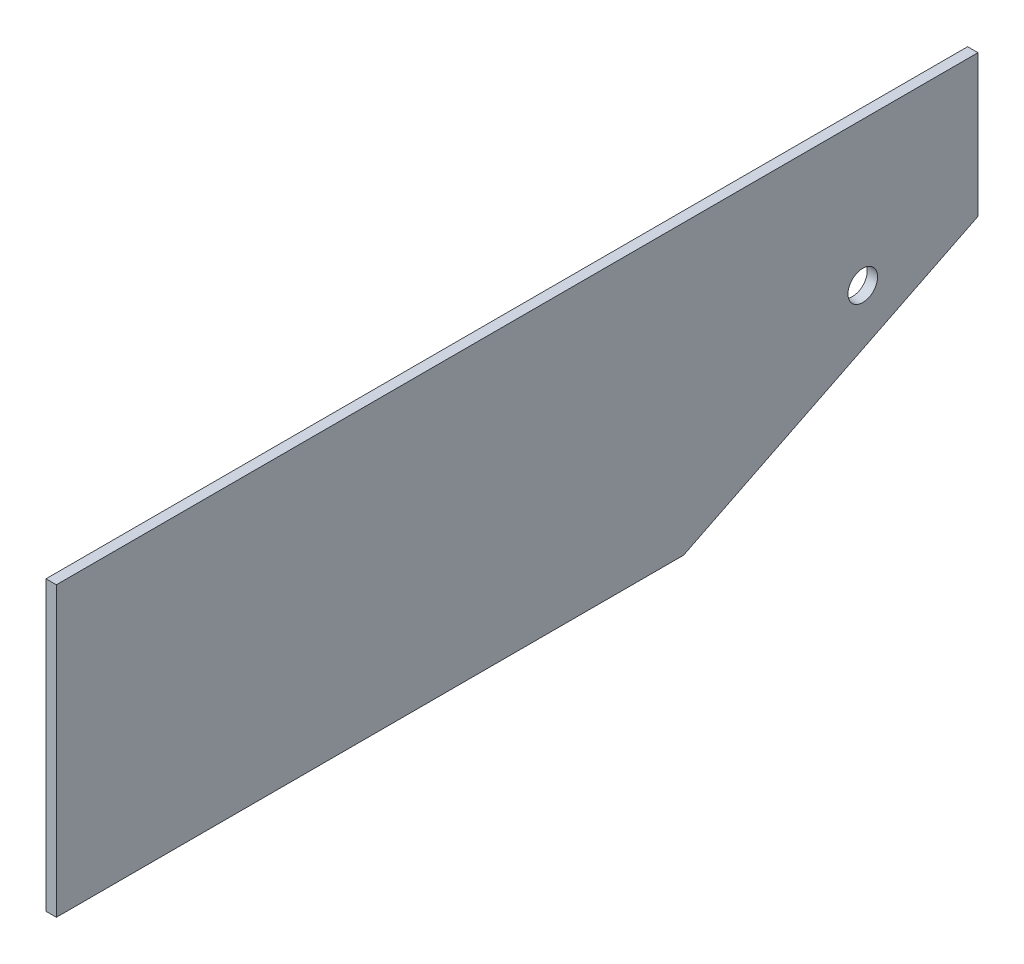
ISO-10303-21;
HEADER;
FILE_DESCRIPTION(('STEP AP214'),'2;1');
FILE_NAME('part.step','',(''),(''),'','','');
FILE_SCHEMA(('AUTOMOTIVE_DESIGN { 1 0 10303 214 1 1 1 1 }'));
ENDSEC;
DATA;
#1=APPLICATION_CONTEXT('core data for automotive mechanical design processes');
#2=APPLICATION_PROTOCOL_DEFINITION('international standard','automotive_design',2000,#1);
#3=PRODUCT_CONTEXT('',#1,'mechanical');
#4=PRODUCT('Part','Part','',(#3));
#5=PRODUCT_RELATED_PRODUCT_CATEGORY('part','',(#4));
#6=PRODUCT_DEFINITION_FORMATION('','',#4);
#7=PRODUCT_DEFINITION_CONTEXT('part definition',#1,'design');
#8=PRODUCT_DEFINITION('design','',#6,#7);
#9=PRODUCT_DEFINITION_SHAPE('','',#8);
#10=(LENGTH_UNIT() NAMED_UNIT(*) SI_UNIT(.MILLI.,.METRE.));
#11=(NAMED_UNIT(*) PLANE_ANGLE_UNIT() SI_UNIT($,.RADIAN.));
#12=(NAMED_UNIT(*) SI_UNIT($,.STERADIAN.) SOLID_ANGLE_UNIT());
#13=UNCERTAINTY_MEASURE_WITH_UNIT(LENGTH_MEASURE(1.E-05),#10,'distance_accuracy_value','');
#14=(GEOMETRIC_REPRESENTATION_CONTEXT(3) GLOBAL_UNCERTAINTY_ASSIGNED_CONTEXT((#13)) GLOBAL_UNIT_ASSIGNED_CONTEXT((#10,
#11,#12)) REPRESENTATION_CONTEXT('',''));
#15=CARTESIAN_POINT('',(0.,0.,0.));
#16=DIRECTION('',(0.,0.,1.));
#17=DIRECTION('',(1.,0.,0.));
#18=AXIS2_PLACEMENT_3D('',#15,#16,#17);
#19=CARTESIAN_POINT('',(1.143,0.,0.));
#20=DIRECTION('',(1.,0.,0.));
#21=DIRECTION('',(0.,0.,-1.));
#22=AXIS2_PLACEMENT_3D('',#19,#20,#21);
#23=PLANE('',#22);
#24=CARTESIAN_POINT('',(1.143,0.,-76.2));
#25=DIRECTION('',(1.,0.,0.));
#26=DIRECTION('',(0.,0.,-1.));
#27=AXIS2_PLACEMENT_3D('',#24,#25,#26);
#28=CIRCLE('',#27,3.2639);
#29=CARTESIAN_POINT('',(1.143,0.,-79.4639));
#30=VERTEX_POINT('',#29);
#31=EDGE_CURVE('E19',#30,#30,#28,.F.);
#32=ORIENTED_EDGE('',*,*,#31,.T.);
#33=EDGE_LOOP('',(#32));
#34=FACE_BOUND('',#33,.T.);
#35=DIRECTION('',(0.,0.,-1.));
#36=VECTOR('',#35,1.);
#37=CARTESIAN_POINT('',(1.143,-31.75,101.6));
#38=LINE('',#37,#36);
#39=CARTESIAN_POINT('',(1.143,-31.7500000000009,-36.692038667694));
#40=VERTEX_POINT('',#39);
#41=CARTESIAN_POINT('',(1.143,-31.75,101.6));
#42=VERTEX_POINT('',#41);
#43=EDGE_CURVE('E77',#40,#42,#38,.F.);
#44=ORIENTED_EDGE('',*,*,#43,.F.);
#45=DIRECTION('',(0.,-0.444883376374209,0.895588511218118));
#46=VECTOR('',#45,1.);
#47=CARTESIAN_POINT('',(1.143,0.493014095617792,-101.6));
#48=LINE('',#47,#46);
#49=CARTESIAN_POINT('',(1.143,0.493014095617792,-101.6));
#50=VERTEX_POINT('',#49);
#51=EDGE_CURVE('E73',#40,#50,#48,.F.);
#52=ORIENTED_EDGE('',*,*,#51,.T.);
#53=DIRECTION('',(0.,1.,0.));
#54=VECTOR('',#53,1.);
#55=CARTESIAN_POINT('',(1.143,-31.75,-101.6));
#56=LINE('',#55,#54);
#57=CARTESIAN_POINT('',(1.143,31.75,-101.6));
#58=VERTEX_POINT('',#57);
#59=EDGE_CURVE('E64',#58,#50,#56,.F.);
#60=ORIENTED_EDGE('',*,*,#59,.F.);
#61=DIRECTION('',(0.,0.,1.));
#62=VECTOR('',#61,1.);
#63=CARTESIAN_POINT('',(1.143,31.75,-101.6));
#64=LINE('',#63,#62);
#65=CARTESIAN_POINT('',(1.143,31.75,101.6));
#66=VERTEX_POINT('',#65);
#67=EDGE_CURVE('E59',#66,#58,#64,.F.);
#68=ORIENTED_EDGE('',*,*,#67,.F.);
#69=DIRECTION('',(0.,1.,0.));
#70=VECTOR('',#69,1.);
#71=CARTESIAN_POINT('',(1.143,31.75,101.6));
#72=LINE('',#71,#70);
#73=EDGE_CURVE('E89',#42,#66,#72,.T.);
#74=ORIENTED_EDGE('',*,*,#73,.F.);
#75=EDGE_LOOP('',(#44,#52,#60,#68,#74));
#76=FACE_BOUND('',#75,.T.);
#77=ADVANCED_FACE('F16',(#34,#76),#23,.T.);
#78=CARTESIAN_POINT('',(1.143,0.493014095617792,-101.6));
#79=DIRECTION('',(0.,0.895588511218118,0.444883376374209));
#80=DIRECTION('',(0.,-0.444883376374209,0.895588511218118));
#81=AXIS2_PLACEMENT_3D('',#78,#79,#80);
#82=PLANE('',#81);
#83=ORIENTED_EDGE('',*,*,#51,.F.);
#84=DIRECTION('',(1.,0.,0.));
#85=VECTOR('',#84,1.);
#86=CARTESIAN_POINT('',(-1.143,-31.75,-36.6920386676936));
#87=LINE('',#86,#85);
#88=CARTESIAN_POINT('',(-1.143,-31.7500000000018,-36.6920386676945));
#89=VERTEX_POINT('',#88);
#90=EDGE_CURVE('E95',#89,#40,#87,.T.);
#91=ORIENTED_EDGE('',*,*,#90,.F.);
#92=DIRECTION('',(0.,0.44488337637416,-0.895588511218142));
#93=VECTOR('',#92,1.);
#94=CARTESIAN_POINT('',(-1.143,-31.75,-36.6920386676936));
#95=LINE('',#94,#93);
#96=CARTESIAN_POINT('',(-1.143,0.493014095617792,-101.6));
#97=VERTEX_POINT('',#96);
#98=EDGE_CURVE('E84',#89,#97,#95,.T.);
#99=ORIENTED_EDGE('',*,*,#98,.T.);
#100=DIRECTION('',(-1.,0.,0.));
#101=VECTOR('',#100,1.);
#102=CARTESIAN_POINT('',(-1.143,0.493014095617791,-101.6));
#103=LINE('',#102,#101);
#104=EDGE_CURVE('E69',#50,#97,#103,.T.);
#105=ORIENTED_EDGE('',*,*,#104,.F.);
#106=EDGE_LOOP('',(#83,#91,#99,#105));
#107=FACE_BOUND('',#106,.T.);
#108=ADVANCED_FACE('F83',(#107),#82,.F.);
#109=CARTESIAN_POINT('',(-1.143,-31.75,-101.6));
#110=DIRECTION('',(0.,0.,-1.));
#111=DIRECTION('',(-1.,0.,0.));
#112=AXIS2_PLACEMENT_3D('',#109,#110,#111);
#113=PLANE('',#112);
#114=ORIENTED_EDGE('',*,*,#59,.T.);
#115=ORIENTED_EDGE('',*,*,#104,.T.);
#116=DIRECTION('',(0.,1.,0.));
#117=VECTOR('',#116,1.);
#118=CARTESIAN_POINT('',(-1.143,0.,-101.6));
#119=LINE('',#118,#117);
#120=CARTESIAN_POINT('',(-1.143,31.75,-101.6));
#121=VERTEX_POINT('',#120);
#122=EDGE_CURVE('E98',#97,#121,#119,.T.);
#123=ORIENTED_EDGE('',*,*,#122,.T.);
#124=DIRECTION('',(1.,0.,0.));
#125=VECTOR('',#124,1.);
#126=CARTESIAN_POINT('',(-1.143,31.75,-101.6));
#127=LINE('',#126,#125);
#128=EDGE_CURVE('E71',#58,#121,#127,.F.);
#129=ORIENTED_EDGE('',*,*,#128,.F.);
#130=EDGE_LOOP('',(#114,#115,#123,#129));
#131=FACE_BOUND('',#130,.T.);
#132=ADVANCED_FACE('F66',(#131),#113,.T.);
#133=CARTESIAN_POINT('',(-1.143,31.75,-101.6));
#134=DIRECTION('',(0.,1.,0.));
#135=DIRECTION('',(0.,0.,1.));
#136=AXIS2_PLACEMENT_3D('',#133,#134,#135);
#137=PLANE('',#136);
#138=ORIENTED_EDGE('',*,*,#128,.T.);
#139=DIRECTION('',(0.,0.,-1.));
#140=VECTOR('',#139,1.);
#141=CARTESIAN_POINT('',(-1.143,31.75,0.));
#142=LINE('',#141,#140);
#143=CARTESIAN_POINT('',(-1.143,31.75,101.6));
#144=VERTEX_POINT('',#143);
#145=EDGE_CURVE('E100',#121,#144,#142,.F.);
#146=ORIENTED_EDGE('',*,*,#145,.T.);
#147=DIRECTION('',(1.,0.,0.));
#148=VECTOR('',#147,1.);
#149=CARTESIAN_POINT('',(-1.143,31.75,101.6));
#150=LINE('',#149,#148);
#151=EDGE_CURVE('E91',#66,#144,#150,.F.);
#152=ORIENTED_EDGE('',*,*,#151,.F.);
#153=ORIENTED_EDGE('',*,*,#67,.T.);
#154=EDGE_LOOP('',(#138,#146,#152,#153));
#155=FACE_BOUND('',#154,.T.);
#156=ADVANCED_FACE('F113',(#155),#137,.T.);
#157=CARTESIAN_POINT('',(-1.143,31.75,101.6));
#158=DIRECTION('',(0.,0.,1.));
#159=DIRECTION('',(1.,0.,0.));
#160=AXIS2_PLACEMENT_3D('',#157,#158,#159);
#161=PLANE('',#160);
#162=ORIENTED_EDGE('',*,*,#151,.T.);
#163=DIRECTION('',(0.,1.,0.));
#164=VECTOR('',#163,1.);
#165=CARTESIAN_POINT('',(-1.143,0.,101.6));
#166=LINE('',#165,#164);
#167=CARTESIAN_POINT('',(-1.143,-31.75,101.6));
#168=VERTEX_POINT('',#167);
#169=EDGE_CURVE('E103',#144,#168,#166,.F.);
#170=ORIENTED_EDGE('',*,*,#169,.T.);
#171=DIRECTION('',(1.,0.,0.));
#172=VECTOR('',#171,1.);
#173=CARTESIAN_POINT('',(-1.143,-31.75,101.6));
#174=LINE('',#173,#172);
#175=EDGE_CURVE('E33',#42,#168,#174,.F.);
#176=ORIENTED_EDGE('',*,*,#175,.F.);
#177=ORIENTED_EDGE('',*,*,#73,.T.);
#178=EDGE_LOOP('',(#162,#170,#176,#177));
#179=FACE_BOUND('',#178,.T.);
#180=ADVANCED_FACE('F112',(#179),#161,.T.);
#181=CARTESIAN_POINT('',(-1.143,-31.75,101.6));
#182=DIRECTION('',(0.,-1.,0.));
#183=DIRECTION('',(0.,0.,-1.));
#184=AXIS2_PLACEMENT_3D('',#181,#182,#183);
#185=PLANE('',#184);
#186=DIRECTION('',(0.,0.,-1.));
#187=VECTOR('',#186,1.);
#188=CARTESIAN_POINT('',(-1.143,-31.75,0.));
#189=LINE('',#188,#187);
#190=EDGE_CURVE('E25',#168,#89,#189,.T.);
#191=ORIENTED_EDGE('',*,*,#190,.T.);
#192=ORIENTED_EDGE('',*,*,#90,.T.);
#193=ORIENTED_EDGE('',*,*,#43,.T.);
#194=ORIENTED_EDGE('',*,*,#175,.T.);
#195=EDGE_LOOP('',(#191,#192,#193,#194));
#196=FACE_BOUND('',#195,.T.);
#197=ADVANCED_FACE('F106',(#196),#185,.T.);
#198=CARTESIAN_POINT('',(1.143,0.,-76.2));
#199=DIRECTION('',(1.,0.,0.));
#200=DIRECTION('',(0.,0.,-1.));
#201=AXIS2_PLACEMENT_3D('',#198,#199,#200);
#202=CYLINDRICAL_SURFACE('',#201,3.2639);
#203=ORIENTED_EDGE('',*,*,#31,.F.);
#204=EDGE_LOOP('',(#203));
#205=FACE_BOUND('',#204,.T.);
#206=CARTESIAN_POINT('',(-1.143,0.,-76.2));
#207=DIRECTION('',(1.,0.,0.));
#208=DIRECTION('',(0.,0.,-1.));
#209=AXIS2_PLACEMENT_3D('',#206,#207,#208);
#210=CIRCLE('',#209,3.2639);
#211=CARTESIAN_POINT('',(-1.143,0.,-79.4639));
#212=VERTEX_POINT('',#211);
#213=EDGE_CURVE('E11',#212,#212,#210,.F.);
#214=ORIENTED_EDGE('',*,*,#213,.T.);
#215=EDGE_LOOP('',(#214));
#216=FACE_BOUND('',#215,.T.);
#217=ADVANCED_FACE('F124',(#205,#216),#202,.F.);
#218=CARTESIAN_POINT('',(-1.143,0.,0.));
#219=DIRECTION('',(1.,0.,0.));
#220=DIRECTION('',(0.,0.,-1.));
#221=AXIS2_PLACEMENT_3D('',#218,#219,#220);
#222=PLANE('',#221);
#223=ORIENTED_EDGE('',*,*,#213,.F.);
#224=EDGE_LOOP('',(#223));
#225=FACE_BOUND('',#224,.T.);
#226=ORIENTED_EDGE('',*,*,#169,.F.);
#227=ORIENTED_EDGE('',*,*,#145,.F.);
#228=ORIENTED_EDGE('',*,*,#122,.F.);
#229=ORIENTED_EDGE('',*,*,#98,.F.);
#230=ORIENTED_EDGE('',*,*,#190,.F.);
#231=EDGE_LOOP('',(#226,#227,#228,#229,#230));
#232=FACE_BOUND('',#231,.T.);
#233=ADVANCED_FACE('F109',(#225,#232),#222,.F.);
#234=CLOSED_SHELL('',(#77,#108,#132,#156,#180,#197,#217,#233));
#235=MANIFOLD_SOLID_BREP('B1',#234);
#236=ADVANCED_BREP_SHAPE_REPRESENTATION('',(#18,#235),#14);
#237=SHAPE_DEFINITION_REPRESENTATION(#9,#236);
ENDSEC;
END-ISO-10303-21;
